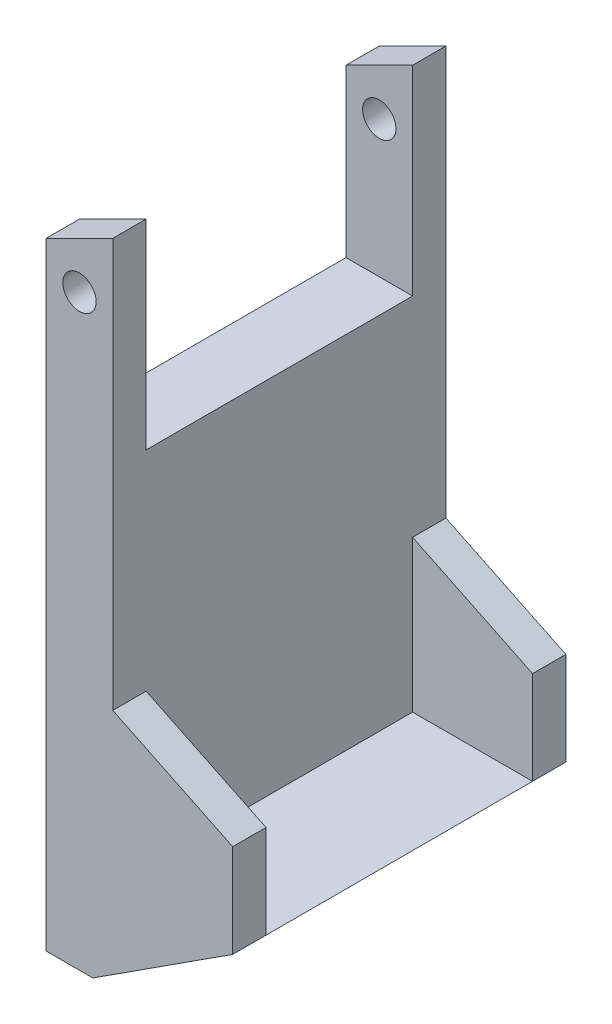
ISO-10303-21;
HEADER;
FILE_DESCRIPTION(('STEP AP214'),'2;1');
FILE_NAME('part.step','',(''),(''),'','','');
FILE_SCHEMA(('AUTOMOTIVE_DESIGN { 1 0 10303 214 1 1 1 1 }'));
ENDSEC;
DATA;
#1=APPLICATION_CONTEXT('core data for automotive mechanical design processes');
#2=APPLICATION_PROTOCOL_DEFINITION('international standard','automotive_design',2000,#1);
#3=PRODUCT_CONTEXT('',#1,'mechanical');
#4=PRODUCT('Part','Part','',(#3));
#5=PRODUCT_RELATED_PRODUCT_CATEGORY('part','',(#4));
#6=PRODUCT_DEFINITION_FORMATION('','',#4);
#7=PRODUCT_DEFINITION_CONTEXT('part definition',#1,'design');
#8=PRODUCT_DEFINITION('design','',#6,#7);
#9=PRODUCT_DEFINITION_SHAPE('','',#8);
#10=(LENGTH_UNIT() NAMED_UNIT(*) SI_UNIT(.MILLI.,.METRE.));
#11=(NAMED_UNIT(*) PLANE_ANGLE_UNIT() SI_UNIT($,.RADIAN.));
#12=(NAMED_UNIT(*) SI_UNIT($,.STERADIAN.) SOLID_ANGLE_UNIT());
#13=UNCERTAINTY_MEASURE_WITH_UNIT(LENGTH_MEASURE(1.E-05),#10,'distance_accuracy_value','');
#14=(GEOMETRIC_REPRESENTATION_CONTEXT(3) GLOBAL_UNCERTAINTY_ASSIGNED_CONTEXT((#13)) GLOBAL_UNIT_ASSIGNED_CONTEXT((#10,
#11,#12)) REPRESENTATION_CONTEXT('',''));
#15=CARTESIAN_POINT('',(0.,0.,0.));
#16=DIRECTION('',(0.,0.,1.));
#17=DIRECTION('',(1.,0.,0.));
#18=AXIS2_PLACEMENT_3D('',#15,#16,#17);
#19=CARTESIAN_POINT('',(-0.0595489410283301,-0.122953176065062,-5.5));
#20=DIRECTION('',(-0.435889894354068,-0.9,0.));
#21=DIRECTION('',(0.9,-0.435889894354068,0.));
#22=AXIS2_PLACEMENT_3D('',#19,#20,#21);
#23=PLANE('',#22);
#24=DIRECTION('',(0.,0.,1.));
#25=VECTOR('',#24,1.);
#26=CARTESIAN_POINT('',(1.,-0.636116149362622,-5.5));
#27=LINE('',#26,#25);
#28=CARTESIAN_POINT('',(1.,-0.636116149362622,-2.5));
#29=VERTEX_POINT('',#28);
#30=CARTESIAN_POINT('',(1.,-0.636116149362623,-2.));
#31=VERTEX_POINT('',#30);
#32=EDGE_CURVE('E178',#29,#31,#27,.T.);
#33=ORIENTED_EDGE('',*,*,#32,.T.);
#34=DIRECTION('',(0.9,-0.435889894354068,0.));
#35=VECTOR('',#34,1.);
#36=CARTESIAN_POINT('',(-0.0595489410283299,-0.122953176065062,-2.));
#37=LINE('',#36,#35);
#38=CARTESIAN_POINT('',(2.8,-1.50789593807076,-2.));
#39=VERTEX_POINT('',#38);
#40=EDGE_CURVE('E161',#31,#39,#37,.T.);
#41=ORIENTED_EDGE('',*,*,#40,.T.);
#42=DIRECTION('',(0.,0.,1.));
#43=VECTOR('',#42,1.);
#44=CARTESIAN_POINT('',(2.8,-1.50789593807076,-5.5));
#45=LINE('',#44,#43);
#46=CARTESIAN_POINT('',(2.8,-1.50789593807076,-2.5));
#47=VERTEX_POINT('',#46);
#48=EDGE_CURVE('E177',#47,#39,#45,.T.);
#49=ORIENTED_EDGE('',*,*,#48,.F.);
#50=DIRECTION('',(0.9,-0.435889894354068,0.));
#51=VECTOR('',#50,1.);
#52=CARTESIAN_POINT('',(8.38195558356497,-4.21136041541436,-2.5));
#53=LINE('',#52,#51);
#54=EDGE_CURVE('E204',#29,#47,#53,.T.);
#55=ORIENTED_EDGE('',*,*,#54,.F.);
#56=EDGE_LOOP('',(#33,#41,#49,#55));
#57=FACE_BOUND('',#56,.T.);
#58=ADVANCED_FACE('F42',(#57),#23,.F.);
#59=CARTESIAN_POINT('',(2.8,0.,-5.5));
#60=DIRECTION('',(-1.,0.,0.));
#61=DIRECTION('',(0.,0.,1.));
#62=AXIS2_PLACEMENT_3D('',#59,#60,#61);
#63=PLANE('',#62);
#64=ORIENTED_EDGE('',*,*,#48,.T.);
#65=DIRECTION('',(0.,1.,0.));
#66=VECTOR('',#65,1.);
#67=CARTESIAN_POINT('',(2.8,-1.50789593807076,-2.));
#68=LINE('',#67,#66);
#69=CARTESIAN_POINT('',(2.8,-2.90789593807076,-2.));
#70=VERTEX_POINT('',#69);
#71=EDGE_CURVE('E280',#70,#39,#68,.T.);
#72=ORIENTED_EDGE('',*,*,#71,.F.);
#73=DIRECTION('',(0.,0.,1.));
#74=VECTOR('',#73,1.);
#75=CARTESIAN_POINT('',(2.8,-2.90789593807076,-5.5));
#76=LINE('',#75,#74);
#77=CARTESIAN_POINT('',(2.8,-2.90789593807076,-2.5));
#78=VERTEX_POINT('',#77);
#79=EDGE_CURVE('E185',#78,#70,#76,.T.);
#80=ORIENTED_EDGE('',*,*,#79,.F.);
#81=DIRECTION('',(0.,-1.,0.));
#82=VECTOR('',#81,1.);
#83=CARTESIAN_POINT('',(2.8,-5.,-2.5));
#84=LINE('',#83,#82);
#85=EDGE_CURVE('E207',#47,#78,#84,.T.);
#86=ORIENTED_EDGE('',*,*,#85,.F.);
#87=EDGE_LOOP('',(#64,#72,#80,#86));
#88=FACE_BOUND('',#87,.T.);
#89=ADVANCED_FACE('F277',(#88),#63,.F.);
#90=CARTESIAN_POINT('',(1.,0.,-5.5));
#91=DIRECTION('',(-1.,0.,0.));
#92=DIRECTION('',(0.,-1.,0.));
#93=AXIS2_PLACEMENT_3D('',#90,#91,#92);
#94=PLANE('',#93);
#95=DIRECTION('',(0.,1.,0.));
#96=VECTOR('',#95,1.);
#97=CARTESIAN_POINT('',(1.,-1.50789593807076,-2.));
#98=LINE('',#97,#96);
#99=CARTESIAN_POINT('',(1.,-2.90789593807076,-2.));
#100=VERTEX_POINT('',#99);
#101=EDGE_CURVE('E293',#100,#31,#98,.T.);
#102=ORIENTED_EDGE('',*,*,#101,.T.);
#103=ORIENTED_EDGE('',*,*,#32,.F.);
#104=DIRECTION('',(0.,-1.,0.));
#105=VECTOR('',#104,1.);
#106=CARTESIAN_POINT('',(1.,-5.,-2.5));
#107=LINE('',#106,#105);
#108=CARTESIAN_POINT('',(1.,5.5,-2.5));
#109=VERTEX_POINT('',#108);
#110=EDGE_CURVE('E190',#109,#29,#107,.T.);
#111=ORIENTED_EDGE('',*,*,#110,.F.);
#112=DIRECTION('',(0.,0.,1.));
#113=VECTOR('',#112,1.);
#114=CARTESIAN_POINT('',(1.,5.5,-2.5));
#115=LINE('',#114,#113);
#116=CARTESIAN_POINT('',(1.,5.5,-2.));
#117=VERTEX_POINT('',#116);
#118=EDGE_CURVE('E247',#109,#117,#115,.T.);
#119=ORIENTED_EDGE('',*,*,#118,.T.);
#120=DIRECTION('',(0.,-1.,0.));
#121=VECTOR('',#120,1.);
#122=CARTESIAN_POINT('',(1.,0.,-2.));
#123=LINE('',#122,#121);
#124=CARTESIAN_POINT('',(1.,2.5,-2.));
#125=VERTEX_POINT('',#124);
#126=EDGE_CURVE('E213',#117,#125,#123,.T.);
#127=ORIENTED_EDGE('',*,*,#126,.T.);
#128=DIRECTION('',(0.,0.,1.));
#129=VECTOR('',#128,1.);
#130=CARTESIAN_POINT('',(1.,2.5,-5.5));
#131=LINE('',#130,#129);
#132=CARTESIAN_POINT('',(1.,2.5,2.));
#133=VERTEX_POINT('',#132);
#134=EDGE_CURVE('E51',#125,#133,#131,.T.);
#135=ORIENTED_EDGE('',*,*,#134,.T.);
#136=DIRECTION('',(0.,1.,0.));
#137=VECTOR('',#136,1.);
#138=CARTESIAN_POINT('',(1.,0.,2.));
#139=LINE('',#138,#137);
#140=CARTESIAN_POINT('',(1.,5.5,2.));
#141=VERTEX_POINT('',#140);
#142=EDGE_CURVE('E11',#133,#141,#139,.T.);
#143=ORIENTED_EDGE('',*,*,#142,.T.);
#144=CARTESIAN_POINT('',(1.,5.5,2.5));
#145=VERTEX_POINT('',#144);
#146=EDGE_CURVE('E244',#141,#145,#115,.T.);
#147=ORIENTED_EDGE('',*,*,#146,.T.);
#148=DIRECTION('',(0.,-1.,0.));
#149=VECTOR('',#148,1.);
#150=CARTESIAN_POINT('',(1.,0.,2.5));
#151=LINE('',#150,#149);
#152=CARTESIAN_POINT('',(1.,-0.636116149362622,2.5));
#153=VERTEX_POINT('',#152);
#154=EDGE_CURVE('E250',#145,#153,#151,.T.);
#155=ORIENTED_EDGE('',*,*,#154,.T.);
#156=CARTESIAN_POINT('',(1.,-0.636116149362623,2.));
#157=VERTEX_POINT('',#156);
#158=EDGE_CURVE('E182',#157,#153,#27,.T.);
#159=ORIENTED_EDGE('',*,*,#158,.F.);
#160=DIRECTION('',(0.,-1.,0.));
#161=VECTOR('',#160,1.);
#162=CARTESIAN_POINT('',(1.,-1.50789593807076,2.));
#163=LINE('',#162,#161);
#164=CARTESIAN_POINT('',(1.,-2.90789593807076,2.));
#165=VERTEX_POINT('',#164);
#166=EDGE_CURVE('E157',#157,#165,#163,.T.);
#167=ORIENTED_EDGE('',*,*,#166,.T.);
#168=DIRECTION('',(0.,0.,-1.));
#169=VECTOR('',#168,1.);
#170=CARTESIAN_POINT('',(1.,-2.90789593807076,2.));
#171=LINE('',#170,#169);
#172=EDGE_CURVE('E284',#165,#100,#171,.T.);
#173=ORIENTED_EDGE('',*,*,#172,.T.);
#174=EDGE_LOOP('',(#102,#103,#111,#119,#127,#135,#143,#147,#155,#159,#167,#173));
#175=FACE_BOUND('',#174,.T.);
#176=ADVANCED_FACE('F218',(#175),#94,.F.);
#177=CARTESIAN_POINT('',(1.,5.5,-2.5));
#178=DIRECTION('',(-0.447213595499959,0.894427190999916,0.));
#179=DIRECTION('',(-0.894427190999916,-0.447213595499959,0.));
#180=AXIS2_PLACEMENT_3D('',#177,#178,#179);
#181=PLANE('',#180);
#182=ORIENTED_EDGE('',*,*,#146,.F.);
#183=DIRECTION('',(-0.894427190999916,-0.447213595499958,0.));
#184=VECTOR('',#183,1.);
#185=CARTESIAN_POINT('',(1.,5.5,2.));
#186=LINE('',#185,#184);
#187=CARTESIAN_POINT('',(0.,5.,2.));
#188=VERTEX_POINT('',#187);
#189=EDGE_CURVE('E290',#141,#188,#186,.T.);
#190=ORIENTED_EDGE('',*,*,#189,.T.);
#191=DIRECTION('',(0.,0.,1.));
#192=VECTOR('',#191,1.);
#193=CARTESIAN_POINT('',(0.,5.,-2.5));
#194=LINE('',#193,#192);
#195=CARTESIAN_POINT('',(0.,5.,2.5));
#196=VERTEX_POINT('',#195);
#197=EDGE_CURVE('E198',#188,#196,#194,.T.);
#198=ORIENTED_EDGE('',*,*,#197,.T.);
#199=DIRECTION('',(-0.894427190999916,-0.447213595499959,0.));
#200=VECTOR('',#199,1.);
#201=CARTESIAN_POINT('',(1.,5.5,2.5));
#202=LINE('',#201,#200);
#203=EDGE_CURVE('E237',#145,#196,#202,.T.);
#204=ORIENTED_EDGE('',*,*,#203,.F.);
#205=EDGE_LOOP('',(#182,#190,#198,#204));
#206=FACE_BOUND('',#205,.T.);
#207=ADVANCED_FACE('F347',(#206),#181,.T.);
#208=CARTESIAN_POINT('',(8.,-5.,2.5));
#209=DIRECTION('',(0.,0.,-1.));
#210=DIRECTION('',(-1.,0.,0.));
#211=AXIS2_PLACEMENT_3D('',#208,#209,#210);
#212=PLANE('',#211);
#213=CARTESIAN_POINT('',(0.5,4.55,2.5));
#214=DIRECTION('',(0.,0.,-1.));
#215=DIRECTION('',(-1.,0.,0.));
#216=AXIS2_PLACEMENT_3D('',#213,#214,#215);
#217=CIRCLE('',#216,0.25);
#218=CARTESIAN_POINT('',(0.25,4.55,2.5));
#219=VERTEX_POINT('',#218);
#220=EDGE_CURVE('E162',#219,#219,#217,.T.);
#221=ORIENTED_EDGE('',*,*,#220,.T.);
#222=EDGE_LOOP('',(#221));
#223=FACE_BOUND('',#222,.T.);
#224=DIRECTION('',(1.,0.,0.));
#225=VECTOR('',#224,1.);
#226=CARTESIAN_POINT('',(0.,-4.26436193469581,2.5));
#227=LINE('',#226,#225);
#228=CARTESIAN_POINT('',(0.,-4.26436193469581,2.5));
#229=VERTEX_POINT('',#228);
#230=CARTESIAN_POINT('',(0.7,-4.26436193469581,2.5));
#231=VERTEX_POINT('',#230);
#232=EDGE_CURVE('E58',#229,#231,#227,.T.);
#233=ORIENTED_EDGE('',*,*,#232,.T.);
#234=DIRECTION('',(-0.84,-0.542586398650022,0.));
#235=VECTOR('',#234,1.);
#236=CARTESIAN_POINT('',(2.14965921913694,-3.32797458352758,2.5));
#237=LINE('',#236,#235);
#238=CARTESIAN_POINT('',(2.8,-2.90789593807076,2.5));
#239=VERTEX_POINT('',#238);
#240=EDGE_CURVE('E256',#239,#231,#237,.T.);
#241=ORIENTED_EDGE('',*,*,#240,.F.);
#242=DIRECTION('',(0.,-1.,0.));
#243=VECTOR('',#242,1.);
#244=CARTESIAN_POINT('',(2.8,0.,2.5));
#245=LINE('',#244,#243);
#246=CARTESIAN_POINT('',(2.8,-1.50789593807076,2.5));
#247=VERTEX_POINT('',#246);
#248=EDGE_CURVE('E254',#247,#239,#245,.T.);
#249=ORIENTED_EDGE('',*,*,#248,.F.);
#250=DIRECTION('',(0.9,-0.435889894354068,0.));
#251=VECTOR('',#250,1.);
#252=CARTESIAN_POINT('',(-0.0595489410283301,-0.122953176065062,2.5));
#253=LINE('',#252,#251);
#254=EDGE_CURVE('E175',#153,#247,#253,.T.);
#255=ORIENTED_EDGE('',*,*,#254,.F.);
#256=ORIENTED_EDGE('',*,*,#154,.F.);
#257=ORIENTED_EDGE('',*,*,#203,.T.);
#258=DIRECTION('',(0.,-1.,0.));
#259=VECTOR('',#258,1.);
#260=CARTESIAN_POINT('',(0.,-5.,2.5));
#261=LINE('',#260,#259);
#262=EDGE_CURVE('E194',#196,#229,#261,.T.);
#263=ORIENTED_EDGE('',*,*,#262,.T.);
#264=EDGE_LOOP('',(#233,#241,#249,#255,#256,#257,#263));
#265=FACE_BOUND('',#264,.T.);
#266=ADVANCED_FACE('F44',(#223,#265),#212,.F.);
#267=CARTESIAN_POINT('',(8.,-5.,-2.5));
#268=DIRECTION('',(0.,0.,1.));
#269=DIRECTION('',(1.,0.,0.));
#270=AXIS2_PLACEMENT_3D('',#267,#268,#269);
#271=PLANE('',#270);
#272=CARTESIAN_POINT('',(0.5,4.55,-2.5));
#273=DIRECTION('',(0.,0.,-1.));
#274=DIRECTION('',(-1.,0.,0.));
#275=AXIS2_PLACEMENT_3D('',#272,#273,#274);
#276=CIRCLE('',#275,0.25);
#277=CARTESIAN_POINT('',(0.25,4.55,-2.5));
#278=VERTEX_POINT('',#277);
#279=EDGE_CURVE('E557',#278,#278,#276,.T.);
#280=ORIENTED_EDGE('',*,*,#279,.F.);
#281=EDGE_LOOP('',(#280));
#282=FACE_BOUND('',#281,.T.);
#283=DIRECTION('',(1.,0.,0.));
#284=VECTOR('',#283,1.);
#285=CARTESIAN_POINT('',(8.,-4.26436193469581,-2.5));
#286=LINE('',#285,#284);
#287=CARTESIAN_POINT('',(0.,-4.26436193469581,-2.5));
#288=VERTEX_POINT('',#287);
#289=CARTESIAN_POINT('',(0.7,-4.26436193469581,-2.5));
#290=VERTEX_POINT('',#289);
#291=EDGE_CURVE('E188',#288,#290,#286,.T.);
#292=ORIENTED_EDGE('',*,*,#291,.F.);
#293=DIRECTION('',(0.,1.,0.));
#294=VECTOR('',#293,1.);
#295=CARTESIAN_POINT('',(0.,-5.,-2.5));
#296=LINE('',#295,#294);
#297=CARTESIAN_POINT('',(0.,5.,-2.5));
#298=VERTEX_POINT('',#297);
#299=EDGE_CURVE('E66',#288,#298,#296,.T.);
#300=ORIENTED_EDGE('',*,*,#299,.T.);
#301=DIRECTION('',(-0.894427190999916,-0.447213595499959,0.));
#302=VECTOR('',#301,1.);
#303=CARTESIAN_POINT('',(1.,5.5,-2.5));
#304=LINE('',#303,#302);
#305=EDGE_CURVE('E241',#109,#298,#304,.T.);
#306=ORIENTED_EDGE('',*,*,#305,.F.);
#307=ORIENTED_EDGE('',*,*,#110,.T.);
#308=ORIENTED_EDGE('',*,*,#54,.T.);
#309=ORIENTED_EDGE('',*,*,#85,.T.);
#310=DIRECTION('',(-0.84,-0.542586398650021,0.));
#311=VECTOR('',#310,1.);
#312=CARTESIAN_POINT('',(5.51559634480685,-1.15379398459943,-2.5));
#313=LINE('',#312,#311);
#314=EDGE_CURVE('E210',#78,#290,#313,.T.);
#315=ORIENTED_EDGE('',*,*,#314,.T.);
#316=EDGE_LOOP('',(#292,#300,#306,#307,#308,#309,#315));
#317=FACE_BOUND('',#316,.T.);
#318=ADVANCED_FACE('F274',(#282,#317),#271,.F.);
#319=CARTESIAN_POINT('',(0.,0.,0.));
#320=DIRECTION('',(1.,0.,0.));
#321=DIRECTION('',(0.,0.,-1.));
#322=AXIS2_PLACEMENT_3D('',#319,#320,#321);
#323=PLANE('',#322);
#324=ORIENTED_EDGE('',*,*,#197,.F.);
#325=DIRECTION('',(0.,1.,0.));
#326=VECTOR('',#325,1.);
#327=CARTESIAN_POINT('',(0.,5.,2.));
#328=LINE('',#327,#326);
#329=CARTESIAN_POINT('',(0.,2.5,2.));
#330=VERTEX_POINT('',#329);
#331=EDGE_CURVE('E297',#330,#188,#328,.T.);
#332=ORIENTED_EDGE('',*,*,#331,.F.);
#333=DIRECTION('',(0.,0.,1.));
#334=VECTOR('',#333,1.);
#335=CARTESIAN_POINT('',(0.,2.5,2.));
#336=LINE('',#335,#334);
#337=CARTESIAN_POINT('',(0.,2.5,-2.));
#338=VERTEX_POINT('',#337);
#339=EDGE_CURVE('E235',#338,#330,#336,.T.);
#340=ORIENTED_EDGE('',*,*,#339,.F.);
#341=DIRECTION('',(0.,-1.,0.));
#342=VECTOR('',#341,1.);
#343=CARTESIAN_POINT('',(0.,5.,-2.));
#344=LINE('',#343,#342);
#345=CARTESIAN_POINT('',(0.,5.,-2.));
#346=VERTEX_POINT('',#345);
#347=EDGE_CURVE('E233',#346,#338,#344,.T.);
#348=ORIENTED_EDGE('',*,*,#347,.F.);
#349=EDGE_CURVE('E199',#298,#346,#194,.T.);
#350=ORIENTED_EDGE('',*,*,#349,.F.);
#351=ORIENTED_EDGE('',*,*,#299,.F.);
#352=DIRECTION('',(0.,0.,-1.));
#353=VECTOR('',#352,1.);
#354=CARTESIAN_POINT('',(0.,-4.26436193469581,0.));
#355=LINE('',#354,#353);
#356=EDGE_CURVE('E202',#229,#288,#355,.T.);
#357=ORIENTED_EDGE('',*,*,#356,.F.);
#358=ORIENTED_EDGE('',*,*,#262,.F.);
#359=EDGE_LOOP('',(#324,#332,#340,#348,#350,#351,#357,#358));
#360=FACE_BOUND('',#359,.T.);
#361=ADVANCED_FACE('F271',(#360),#323,.F.);
#362=CARTESIAN_POINT('',(2.14965921913694,-3.32797458352758,-5.5));
#363=DIRECTION('',(-0.542586398650021,0.84,0.));
#364=DIRECTION('',(-0.84,-0.542586398650021,0.));
#365=AXIS2_PLACEMENT_3D('',#362,#363,#364);
#366=PLANE('',#365);
#367=ORIENTED_EDGE('',*,*,#79,.T.);
#368=DIRECTION('',(0.,0.,-1.));
#369=VECTOR('',#368,1.);
#370=CARTESIAN_POINT('',(2.8,-2.90789593807076,2.));
#371=LINE('',#370,#369);
#372=CARTESIAN_POINT('',(2.8,-2.90789593807076,2.));
#373=VERTEX_POINT('',#372);
#374=EDGE_CURVE('E171',#373,#70,#371,.T.);
#375=ORIENTED_EDGE('',*,*,#374,.F.);
#376=EDGE_CURVE('E169',#373,#239,#76,.T.);
#377=ORIENTED_EDGE('',*,*,#376,.T.);
#378=ORIENTED_EDGE('',*,*,#240,.T.);
#379=DIRECTION('',(0.,0.,1.));
#380=VECTOR('',#379,1.);
#381=CARTESIAN_POINT('',(0.7,-4.26436193469581,-5.5));
#382=LINE('',#381,#380);
#383=EDGE_CURVE('E191',#290,#231,#382,.T.);
#384=ORIENTED_EDGE('',*,*,#383,.F.);
#385=ORIENTED_EDGE('',*,*,#314,.F.);
#386=EDGE_LOOP('',(#367,#375,#377,#378,#384,#385));
#387=FACE_BOUND('',#386,.T.);
#388=ADVANCED_FACE('F262',(#387),#366,.F.);
#389=ORIENTED_EDGE('',*,*,#376,.F.);
#390=DIRECTION('',(0.,-1.,0.));
#391=VECTOR('',#390,1.);
#392=CARTESIAN_POINT('',(2.8,-1.50789593807076,2.));
#393=LINE('',#392,#391);
#394=CARTESIAN_POINT('',(2.8,-1.50789593807076,2.));
#395=VERTEX_POINT('',#394);
#396=EDGE_CURVE('E154',#395,#373,#393,.T.);
#397=ORIENTED_EDGE('',*,*,#396,.F.);
#398=EDGE_CURVE('E167',#395,#247,#45,.T.);
#399=ORIENTED_EDGE('',*,*,#398,.T.);
#400=ORIENTED_EDGE('',*,*,#248,.T.);
#401=EDGE_LOOP('',(#389,#397,#399,#400));
#402=FACE_BOUND('',#401,.T.);
#403=ADVANCED_FACE('F165',(#402),#63,.F.);
#404=ORIENTED_EDGE('',*,*,#398,.F.);
#405=DIRECTION('',(-0.9,0.435889894354068,0.));
#406=VECTOR('',#405,1.);
#407=CARTESIAN_POINT('',(-0.0595489410283297,-0.122953176065062,2.));
#408=LINE('',#407,#406);
#409=EDGE_CURVE('E151',#395,#157,#408,.T.);
#410=ORIENTED_EDGE('',*,*,#409,.T.);
#411=ORIENTED_EDGE('',*,*,#158,.T.);
#412=ORIENTED_EDGE('',*,*,#254,.T.);
#413=EDGE_LOOP('',(#404,#410,#411,#412));
#414=FACE_BOUND('',#413,.T.);
#415=ADVANCED_FACE('F173',(#414),#23,.F.);
#416=CARTESIAN_POINT('',(0.,-4.26436193469581,-5.5));
#417=DIRECTION('',(0.,-1.,0.));
#418=DIRECTION('',(0.,0.,-1.));
#419=AXIS2_PLACEMENT_3D('',#416,#417,#418);
#420=PLANE('',#419);
#421=ORIENTED_EDGE('',*,*,#291,.T.);
#422=ORIENTED_EDGE('',*,*,#383,.T.);
#423=ORIENTED_EDGE('',*,*,#232,.F.);
#424=ORIENTED_EDGE('',*,*,#356,.T.);
#425=EDGE_LOOP('',(#421,#422,#423,#424));
#426=FACE_BOUND('',#425,.T.);
#427=ADVANCED_FACE('F273',(#426),#420,.T.);
#428=DIRECTION('',(-0.894427190999916,-0.447213595499958,0.));
#429=VECTOR('',#428,1.);
#430=CARTESIAN_POINT('',(1.,5.5,-2.));
#431=LINE('',#430,#429);
#432=EDGE_CURVE('E295',#117,#346,#431,.T.);
#433=ORIENTED_EDGE('',*,*,#432,.F.);
#434=ORIENTED_EDGE('',*,*,#118,.F.);
#435=ORIENTED_EDGE('',*,*,#305,.T.);
#436=ORIENTED_EDGE('',*,*,#349,.T.);
#437=EDGE_LOOP('',(#433,#434,#435,#436));
#438=FACE_BOUND('',#437,.T.);
#439=ADVANCED_FACE('F304',(#438),#181,.T.);
#440=CARTESIAN_POINT('',(5.,5.,2.));
#441=DIRECTION('',(0.,0.,1.));
#442=DIRECTION('',(0.,-1.,0.));
#443=AXIS2_PLACEMENT_3D('',#440,#441,#442);
#444=PLANE('',#443);
#445=CARTESIAN_POINT('',(0.5,4.55,2.));
#446=DIRECTION('',(0.,0.,1.));
#447=DIRECTION('',(0.,-1.,0.));
#448=AXIS2_PLACEMENT_3D('',#445,#446,#447);
#449=CIRCLE('',#448,0.25);
#450=CARTESIAN_POINT('',(0.5,4.3,2.));
#451=VERTEX_POINT('',#450);
#452=EDGE_CURVE('E552',#451,#451,#449,.T.);
#453=ORIENTED_EDGE('',*,*,#452,.T.);
#454=EDGE_LOOP('',(#453));
#455=FACE_BOUND('',#454,.T.);
#456=ORIENTED_EDGE('',*,*,#331,.T.);
#457=ORIENTED_EDGE('',*,*,#189,.F.);
#458=ORIENTED_EDGE('',*,*,#142,.F.);
#459=DIRECTION('',(-1.,0.,0.));
#460=VECTOR('',#459,1.);
#461=CARTESIAN_POINT('',(5.,2.5,2.));
#462=LINE('',#461,#460);
#463=EDGE_CURVE('E228',#133,#330,#462,.T.);
#464=ORIENTED_EDGE('',*,*,#463,.T.);
#465=EDGE_LOOP('',(#456,#457,#458,#464));
#466=FACE_BOUND('',#465,.T.);
#467=ADVANCED_FACE('F301',(#455,#466),#444,.F.);
#468=CARTESIAN_POINT('',(5.,2.5,2.));
#469=DIRECTION('',(0.,-1.,0.));
#470=DIRECTION('',(0.,0.,-1.));
#471=AXIS2_PLACEMENT_3D('',#468,#469,#470);
#472=PLANE('',#471);
#473=DIRECTION('',(-1.,0.,0.));
#474=VECTOR('',#473,1.);
#475=CARTESIAN_POINT('',(5.,2.5,-2.));
#476=LINE('',#475,#474);
#477=EDGE_CURVE('E226',#125,#338,#476,.T.);
#478=ORIENTED_EDGE('',*,*,#477,.T.);
#479=ORIENTED_EDGE('',*,*,#339,.T.);
#480=ORIENTED_EDGE('',*,*,#463,.F.);
#481=ORIENTED_EDGE('',*,*,#134,.F.);
#482=EDGE_LOOP('',(#478,#479,#480,#481));
#483=FACE_BOUND('',#482,.T.);
#484=ADVANCED_FACE('F224',(#483),#472,.F.);
#485=CARTESIAN_POINT('',(5.,5.,-2.));
#486=DIRECTION('',(0.,0.,-1.));
#487=DIRECTION('',(0.,1.,0.));
#488=AXIS2_PLACEMENT_3D('',#485,#486,#487);
#489=PLANE('',#488);
#490=CARTESIAN_POINT('',(0.5,4.55,-2.));
#491=DIRECTION('',(0.,0.,-1.));
#492=DIRECTION('',(0.,1.,0.));
#493=AXIS2_PLACEMENT_3D('',#490,#491,#492);
#494=CIRCLE('',#493,0.25);
#495=CARTESIAN_POINT('',(0.5,4.8,-2.));
#496=VERTEX_POINT('',#495);
#497=EDGE_CURVE('E46',#496,#496,#494,.T.);
#498=ORIENTED_EDGE('',*,*,#497,.T.);
#499=EDGE_LOOP('',(#498));
#500=FACE_BOUND('',#499,.T.);
#501=ORIENTED_EDGE('',*,*,#477,.F.);
#502=ORIENTED_EDGE('',*,*,#126,.F.);
#503=ORIENTED_EDGE('',*,*,#432,.T.);
#504=ORIENTED_EDGE('',*,*,#347,.T.);
#505=EDGE_LOOP('',(#501,#502,#503,#504));
#506=FACE_BOUND('',#505,.T.);
#507=ADVANCED_FACE('F230',(#500,#506),#489,.F.);
#508=CARTESIAN_POINT('',(1.,-1.50789593807076,-2.));
#509=DIRECTION('',(0.,0.,-1.));
#510=DIRECTION('',(-1.,0.,0.));
#511=AXIS2_PLACEMENT_3D('',#508,#509,#510);
#512=PLANE('',#511);
#513=ORIENTED_EDGE('',*,*,#71,.T.);
#514=ORIENTED_EDGE('',*,*,#40,.F.);
#515=ORIENTED_EDGE('',*,*,#101,.F.);
#516=DIRECTION('',(1.,0.,0.));
#517=VECTOR('',#516,1.);
#518=CARTESIAN_POINT('',(1.,-2.90789593807076,-2.));
#519=LINE('',#518,#517);
#520=EDGE_CURVE('E288',#100,#70,#519,.T.);
#521=ORIENTED_EDGE('',*,*,#520,.T.);
#522=EDGE_LOOP('',(#513,#514,#515,#521));
#523=FACE_BOUND('',#522,.T.);
#524=ADVANCED_FACE('F316',(#523),#512,.F.);
#525=CARTESIAN_POINT('',(1.,-2.90789593807076,2.));
#526=DIRECTION('',(0.,-1.,0.));
#527=DIRECTION('',(0.,0.,-1.));
#528=AXIS2_PLACEMENT_3D('',#525,#526,#527);
#529=PLANE('',#528);
#530=ORIENTED_EDGE('',*,*,#374,.T.);
#531=ORIENTED_EDGE('',*,*,#520,.F.);
#532=ORIENTED_EDGE('',*,*,#172,.F.);
#533=DIRECTION('',(1.,0.,0.));
#534=VECTOR('',#533,1.);
#535=CARTESIAN_POINT('',(1.,-2.90789593807076,2.));
#536=LINE('',#535,#534);
#537=EDGE_CURVE('E291',#165,#373,#536,.T.);
#538=ORIENTED_EDGE('',*,*,#537,.T.);
#539=EDGE_LOOP('',(#530,#531,#532,#538));
#540=FACE_BOUND('',#539,.T.);
#541=ADVANCED_FACE('F317',(#540),#529,.F.);
#542=CARTESIAN_POINT('',(1.,-1.50789593807076,2.));
#543=DIRECTION('',(0.,0.,1.));
#544=DIRECTION('',(1.,0.,0.));
#545=AXIS2_PLACEMENT_3D('',#542,#543,#544);
#546=PLANE('',#545);
#547=ORIENTED_EDGE('',*,*,#396,.T.);
#548=ORIENTED_EDGE('',*,*,#537,.F.);
#549=ORIENTED_EDGE('',*,*,#166,.F.);
#550=ORIENTED_EDGE('',*,*,#409,.F.);
#551=EDGE_LOOP('',(#547,#548,#549,#550));
#552=FACE_BOUND('',#551,.T.);
#553=ADVANCED_FACE('F153',(#552),#546,.F.);
#554=CARTESIAN_POINT('',(0.5,4.55,7.5));
#555=DIRECTION('',(0.,0.,-1.));
#556=DIRECTION('',(-1.,0.,0.));
#557=AXIS2_PLACEMENT_3D('',#554,#555,#556);
#558=CYLINDRICAL_SURFACE('',#557,0.25);
#559=ORIENTED_EDGE('',*,*,#279,.T.);
#560=EDGE_LOOP('',(#559));
#561=FACE_BOUND('',#560,.T.);
#562=ORIENTED_EDGE('',*,*,#497,.F.);
#563=EDGE_LOOP('',(#562));
#564=FACE_BOUND('',#563,.T.);
#565=ADVANCED_FACE('F324',(#561,#564),#558,.F.);
#566=ORIENTED_EDGE('',*,*,#452,.F.);
#567=EDGE_LOOP('',(#566));
#568=FACE_BOUND('',#567,.T.);
#569=ORIENTED_EDGE('',*,*,#220,.F.);
#570=EDGE_LOOP('',(#569));
#571=FACE_BOUND('',#570,.T.);
#572=ADVANCED_FACE('F533',(#568,#571),#558,.F.);
#573=CLOSED_SHELL('',(#58,#89,#176,#207,#266,#318,#361,#388,#403,#415,#427,#439,#467,#484,#507,
#524,#541,#553,#565,#572));
#574=MANIFOLD_SOLID_BREP('B2',#573);
#575=ADVANCED_BREP_SHAPE_REPRESENTATION('',(#18,#574),#14);
#576=SHAPE_DEFINITION_REPRESENTATION(#9,#575);
ENDSEC;
END-ISO-10303-21;
